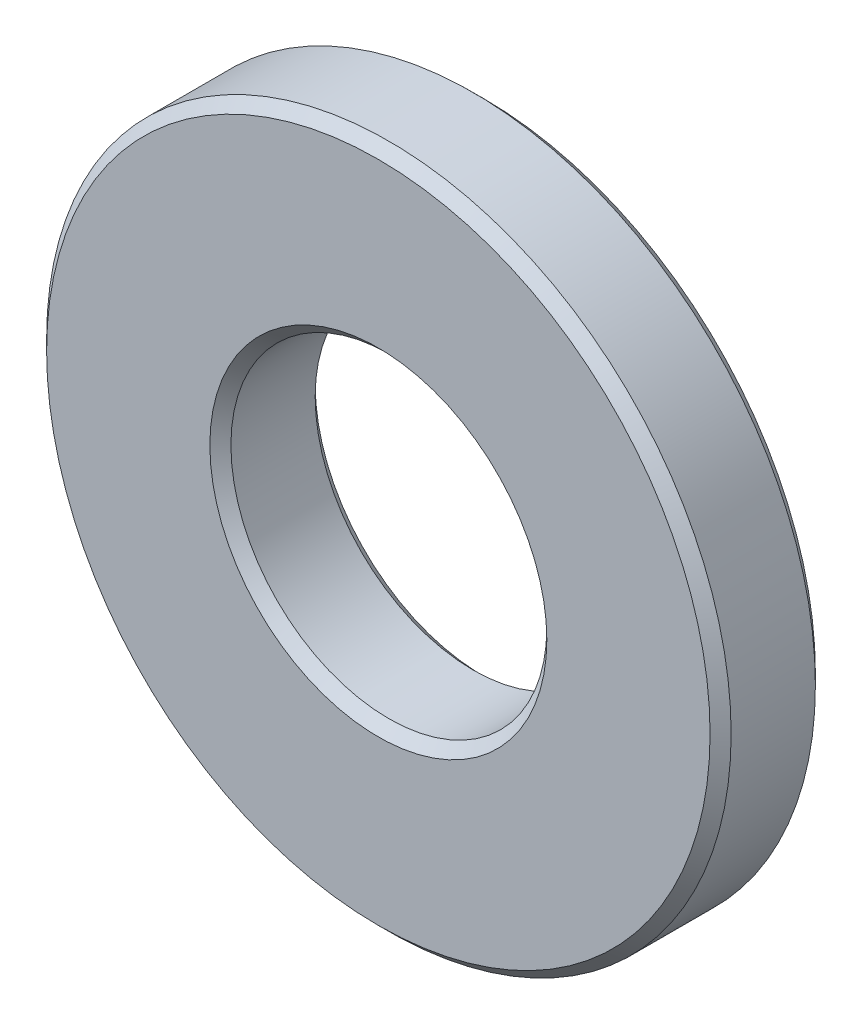
ISO-10303-21;
HEADER;
FILE_DESCRIPTION(('STEP AP214'),'2;1');
FILE_NAME('part.step','',(''),(''),'','','');
FILE_SCHEMA(('AUTOMOTIVE_DESIGN { 1 0 10303 214 1 1 1 1 }'));
ENDSEC;
DATA;
#1=APPLICATION_CONTEXT('core data for automotive mechanical design processes');
#2=APPLICATION_PROTOCOL_DEFINITION('international standard','automotive_design',2000,#1);
#3=PRODUCT_CONTEXT('',#1,'mechanical');
#4=PRODUCT('Part','Part','',(#3));
#5=PRODUCT_RELATED_PRODUCT_CATEGORY('part','',(#4));
#6=PRODUCT_DEFINITION_FORMATION('','',#4);
#7=PRODUCT_DEFINITION_CONTEXT('part definition',#1,'design');
#8=PRODUCT_DEFINITION('design','',#6,#7);
#9=PRODUCT_DEFINITION_SHAPE('','',#8);
#10=(LENGTH_UNIT() NAMED_UNIT(*) SI_UNIT(.MILLI.,.METRE.));
#11=(NAMED_UNIT(*) PLANE_ANGLE_UNIT() SI_UNIT($,.RADIAN.));
#12=(NAMED_UNIT(*) SI_UNIT($,.STERADIAN.) SOLID_ANGLE_UNIT());
#13=UNCERTAINTY_MEASURE_WITH_UNIT(LENGTH_MEASURE(1.E-05),#10,'distance_accuracy_value','');
#14=(GEOMETRIC_REPRESENTATION_CONTEXT(3) GLOBAL_UNCERTAINTY_ASSIGNED_CONTEXT((#13)) GLOBAL_UNIT_ASSIGNED_CONTEXT((#10,
#11,#12)) REPRESENTATION_CONTEXT('',''));
#15=CARTESIAN_POINT('',(0.,0.,0.));
#16=DIRECTION('',(0.,0.,1.));
#17=DIRECTION('',(1.,0.,0.));
#18=AXIS2_PLACEMENT_3D('',#15,#16,#17);
#19=CARTESIAN_POINT('',(0.,0.,5.));
#20=DIRECTION('',(0.,0.,1.));
#21=DIRECTION('',(1.,0.,0.));
#22=AXIS2_PLACEMENT_3D('',#19,#20,#21);
#23=PLANE('',#22);
#24=CARTESIAN_POINT('',(0.,0.,5.));
#25=DIRECTION('',(0.,0.,1.));
#26=DIRECTION('',(1.,0.,0.));
#27=AXIS2_PLACEMENT_3D('',#24,#25,#26);
#28=CIRCLE('',#27,31.5);
#29=CARTESIAN_POINT('',(31.5,0.,5.));
#30=VERTEX_POINT('',#29);
#31=EDGE_CURVE('E10',#30,#30,#28,.T.);
#32=ORIENTED_EDGE('',*,*,#31,.T.);
#33=EDGE_LOOP('',(#32));
#34=FACE_BOUND('',#33,.T.);
#35=CARTESIAN_POINT('',(0.,0.,5.));
#36=DIRECTION('',(0.,0.,1.));
#37=DIRECTION('',(1.,0.,0.));
#38=AXIS2_PLACEMENT_3D('',#35,#36,#37);
#39=CIRCLE('',#38,16.);
#40=CARTESIAN_POINT('',(16.,0.,5.));
#41=VERTEX_POINT('',#40);
#42=EDGE_CURVE('E43',#41,#41,#39,.F.);
#43=ORIENTED_EDGE('',*,*,#42,.T.);
#44=EDGE_LOOP('',(#43));
#45=FACE_BOUND('',#44,.T.);
#46=ADVANCED_FACE('F36',(#34,#45),#23,.T.);
#47=CARTESIAN_POINT('',(0.,0.,-5.));
#48=DIRECTION('',(0.,0.,1.));
#49=DIRECTION('',(1.,0.,0.));
#50=AXIS2_PLACEMENT_3D('',#47,#48,#49);
#51=PLANE('',#50);
#52=CARTESIAN_POINT('',(0.,0.,-5.));
#53=DIRECTION('',(0.,0.,1.));
#54=DIRECTION('',(1.,0.,0.));
#55=AXIS2_PLACEMENT_3D('',#52,#53,#54);
#56=CIRCLE('',#55,16.);
#57=CARTESIAN_POINT('',(16.,0.,-5.));
#58=VERTEX_POINT('',#57);
#59=EDGE_CURVE('E62',#58,#58,#56,.T.);
#60=ORIENTED_EDGE('',*,*,#59,.T.);
#61=EDGE_LOOP('',(#60));
#62=FACE_BOUND('',#61,.T.);
#63=CARTESIAN_POINT('',(0.,0.,-5.));
#64=DIRECTION('',(0.,0.,1.));
#65=DIRECTION('',(1.,0.,0.));
#66=AXIS2_PLACEMENT_3D('',#63,#64,#65);
#67=CIRCLE('',#66,31.5);
#68=CARTESIAN_POINT('',(31.5,0.,-5.));
#69=VERTEX_POINT('',#68);
#70=EDGE_CURVE('E65',#69,#69,#67,.F.);
#71=ORIENTED_EDGE('',*,*,#70,.T.);
#72=EDGE_LOOP('',(#71));
#73=FACE_BOUND('',#72,.T.);
#74=ADVANCED_FACE('F69',(#62,#73),#51,.F.);
#75=CARTESIAN_POINT('',(0.,0.,5.));
#76=DIRECTION('',(0.,0.,-1.));
#77=DIRECTION('',(-1.,0.,0.));
#78=AXIS2_PLACEMENT_3D('',#75,#76,#77);
#79=CYLINDRICAL_SURFACE('',#78,32.5);
#80=CARTESIAN_POINT('',(0.,0.,-3.99999999999998));
#81=DIRECTION('',(0.,0.,1.));
#82=DIRECTION('',(1.,0.,0.));
#83=AXIS2_PLACEMENT_3D('',#80,#81,#82);
#84=CIRCLE('',#83,32.5);
#85=CARTESIAN_POINT('',(32.5,0.,-3.99999999999998));
#86=VERTEX_POINT('',#85);
#87=EDGE_CURVE('E47',#86,#86,#84,.T.);
#88=ORIENTED_EDGE('',*,*,#87,.T.);
#89=EDGE_LOOP('',(#88));
#90=FACE_BOUND('',#89,.T.);
#91=CARTESIAN_POINT('',(0.,0.,3.99999999999999));
#92=DIRECTION('',(0.,0.,1.));
#93=DIRECTION('',(1.,0.,0.));
#94=AXIS2_PLACEMENT_3D('',#91,#92,#93);
#95=CIRCLE('',#94,32.5);
#96=CARTESIAN_POINT('',(32.5,0.,3.99999999999999));
#97=VERTEX_POINT('',#96);
#98=EDGE_CURVE('E51',#97,#97,#95,.F.);
#99=ORIENTED_EDGE('',*,*,#98,.T.);
#100=EDGE_LOOP('',(#99));
#101=FACE_BOUND('',#100,.T.);
#102=ADVANCED_FACE('F79',(#90,#101),#79,.T.);
#103=CARTESIAN_POINT('',(0.,0.,5.));
#104=DIRECTION('',(0.,0.,-1.));
#105=DIRECTION('',(-1.,0.,0.));
#106=AXIS2_PLACEMENT_3D('',#103,#104,#105);
#107=CYLINDRICAL_SURFACE('',#106,15.);
#108=CARTESIAN_POINT('',(0.,0.,-3.99999999999998));
#109=DIRECTION('',(0.,0.,1.));
#110=DIRECTION('',(1.,0.,0.));
#111=AXIS2_PLACEMENT_3D('',#108,#109,#110);
#112=CIRCLE('',#111,15.);
#113=CARTESIAN_POINT('',(15.,0.,-3.99999999999998));
#114=VERTEX_POINT('',#113);
#115=EDGE_CURVE('E56',#114,#114,#112,.F.);
#116=ORIENTED_EDGE('',*,*,#115,.T.);
#117=EDGE_LOOP('',(#116));
#118=FACE_BOUND('',#117,.T.);
#119=CARTESIAN_POINT('',(0.,0.,3.99999999999997));
#120=DIRECTION('',(0.,0.,1.));
#121=DIRECTION('',(1.,0.,0.));
#122=AXIS2_PLACEMENT_3D('',#119,#120,#121);
#123=CIRCLE('',#122,15.);
#124=CARTESIAN_POINT('',(15.,0.,3.99999999999997));
#125=VERTEX_POINT('',#124);
#126=EDGE_CURVE('E59',#125,#125,#123,.T.);
#127=ORIENTED_EDGE('',*,*,#126,.T.);
#128=EDGE_LOOP('',(#127));
#129=FACE_BOUND('',#128,.T.);
#130=ADVANCED_FACE('F82',(#118,#129),#107,.F.);
#131=CARTESIAN_POINT('',(0.,0.,-5.));
#132=DIRECTION('',(0.,0.,-1.));
#133=DIRECTION('',(-1.,0.,0.));
#134=AXIS2_PLACEMENT_3D('',#131,#132,#133);
#135=CONICAL_SURFACE('',#134,16.,0.78539816339745);
#136=ORIENTED_EDGE('',*,*,#115,.F.);
#137=EDGE_LOOP('',(#136));
#138=FACE_BOUND('',#137,.T.);
#139=ORIENTED_EDGE('',*,*,#59,.F.);
#140=EDGE_LOOP('',(#139));
#141=FACE_BOUND('',#140,.T.);
#142=ADVANCED_FACE('F75',(#138,#141),#135,.F.);
#143=CARTESIAN_POINT('',(0.,0.,-3.99999999999998));
#144=DIRECTION('',(0.,0.,1.));
#145=DIRECTION('',(1.,0.,0.));
#146=AXIS2_PLACEMENT_3D('',#143,#144,#145);
#147=CONICAL_SURFACE('',#146,32.5,0.785398163397452);
#148=ORIENTED_EDGE('',*,*,#70,.F.);
#149=EDGE_LOOP('',(#148));
#150=FACE_BOUND('',#149,.T.);
#151=ORIENTED_EDGE('',*,*,#87,.F.);
#152=EDGE_LOOP('',(#151));
#153=FACE_BOUND('',#152,.T.);
#154=ADVANCED_FACE('F71',(#150,#153),#147,.T.);
#155=CARTESIAN_POINT('',(0.,0.,5.));
#156=DIRECTION('',(0.,0.,-1.));
#157=DIRECTION('',(-1.,0.,0.));
#158=AXIS2_PLACEMENT_3D('',#155,#156,#157);
#159=CONICAL_SURFACE('',#158,31.5,0.785398163397438);
#160=ORIENTED_EDGE('',*,*,#98,.F.);
#161=EDGE_LOOP('',(#160));
#162=FACE_BOUND('',#161,.T.);
#163=ORIENTED_EDGE('',*,*,#31,.F.);
#164=EDGE_LOOP('',(#163));
#165=FACE_BOUND('',#164,.T.);
#166=ADVANCED_FACE('F74',(#162,#165),#159,.T.);
#167=CARTESIAN_POINT('',(0.,0.,3.99999999999997));
#168=DIRECTION('',(0.,0.,1.));
#169=DIRECTION('',(1.,0.,0.));
#170=AXIS2_PLACEMENT_3D('',#167,#168,#169);
#171=CONICAL_SURFACE('',#170,15.,0.785398163397449);
#172=ORIENTED_EDGE('',*,*,#42,.F.);
#173=EDGE_LOOP('',(#172));
#174=FACE_BOUND('',#173,.T.);
#175=ORIENTED_EDGE('',*,*,#126,.F.);
#176=EDGE_LOOP('',(#175));
#177=FACE_BOUND('',#176,.T.);
#178=ADVANCED_FACE('F38',(#174,#177),#171,.F.);
#179=CLOSED_SHELL('',(#46,#74,#102,#130,#142,#154,#166,#178));
#180=MANIFOLD_SOLID_BREP('B2',#179);
#181=ADVANCED_BREP_SHAPE_REPRESENTATION('',(#18,#180),#14);
#182=SHAPE_DEFINITION_REPRESENTATION(#9,#181);
ENDSEC;
END-ISO-10303-21;
